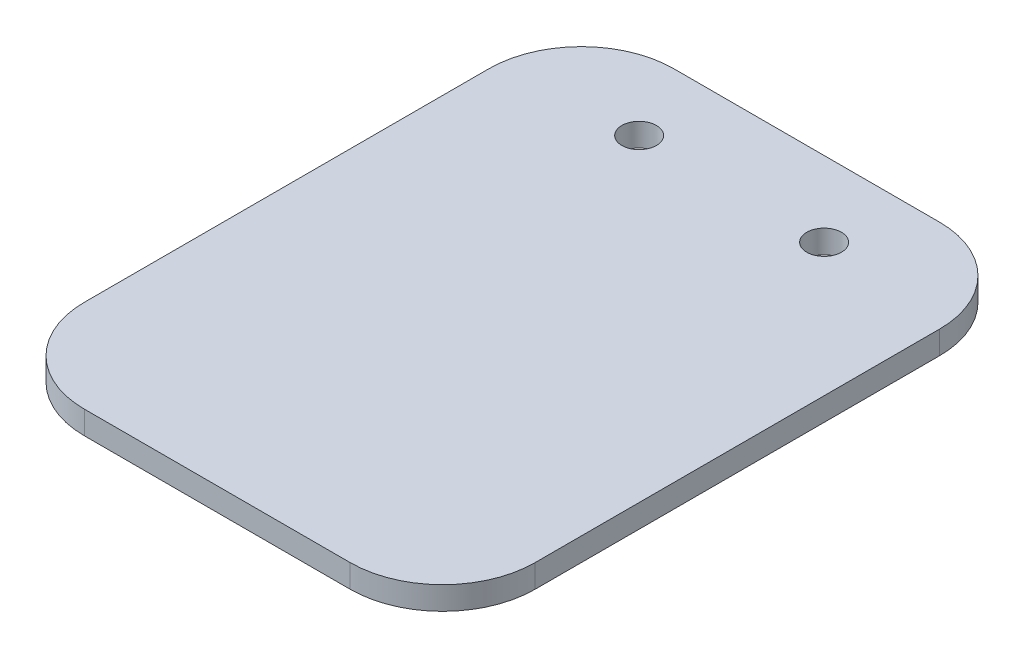
ISO-10303-21;
HEADER;
FILE_DESCRIPTION(('STEP AP214'),'2;1');
FILE_NAME('part.step','',(''),(''),'','','');
FILE_SCHEMA(('AUTOMOTIVE_DESIGN { 1 0 10303 214 1 1 1 1 }'));
ENDSEC;
DATA;
#1=APPLICATION_CONTEXT('core data for automotive mechanical design processes');
#2=APPLICATION_PROTOCOL_DEFINITION('international standard','automotive_design',2000,#1);
#3=PRODUCT_CONTEXT('',#1,'mechanical');
#4=PRODUCT('Part','Part','',(#3));
#5=PRODUCT_RELATED_PRODUCT_CATEGORY('part','',(#4));
#6=PRODUCT_DEFINITION_FORMATION('','',#4);
#7=PRODUCT_DEFINITION_CONTEXT('part definition',#1,'design');
#8=PRODUCT_DEFINITION('design','',#6,#7);
#9=PRODUCT_DEFINITION_SHAPE('','',#8);
#10=(LENGTH_UNIT() NAMED_UNIT(*) SI_UNIT(.MILLI.,.METRE.));
#11=(NAMED_UNIT(*) PLANE_ANGLE_UNIT() SI_UNIT($,.RADIAN.));
#12=(NAMED_UNIT(*) SI_UNIT($,.STERADIAN.) SOLID_ANGLE_UNIT());
#13=UNCERTAINTY_MEASURE_WITH_UNIT(LENGTH_MEASURE(1.E-05),#10,'distance_accuracy_value','');
#14=(GEOMETRIC_REPRESENTATION_CONTEXT(3) GLOBAL_UNCERTAINTY_ASSIGNED_CONTEXT((#13)) GLOBAL_UNIT_ASSIGNED_CONTEXT((#10,
#11,#12)) REPRESENTATION_CONTEXT('',''));
#15=CARTESIAN_POINT('',(0.,0.,0.));
#16=DIRECTION('',(0.,0.,1.));
#17=DIRECTION('',(1.,0.,0.));
#18=AXIS2_PLACEMENT_3D('',#15,#16,#17);
#19=CARTESIAN_POINT('',(8.,2.,-8.));
#20=DIRECTION('',(0.,-1.,0.));
#21=DIRECTION('',(0.,0.,-1.));
#22=AXIS2_PLACEMENT_3D('',#19,#20,#21);
#23=PLANE('',#22);
#24=CARTESIAN_POINT('',(8.,2.,-8.));
#25=DIRECTION('',(0.,1.,0.));
#26=DIRECTION('',(0.,0.,-1.));
#27=AXIS2_PLACEMENT_3D('',#24,#25,#26);
#28=CIRCLE('',#27,8.);
#29=CARTESIAN_POINT('',(0.,2.,-8.00000000000006));
#30=VERTEX_POINT('',#29);
#31=CARTESIAN_POINT('',(8.00000000000006,2.,0.));
#32=VERTEX_POINT('',#31);
#33=EDGE_CURVE('E170',#30,#32,#28,.T.);
#34=ORIENTED_EDGE('',*,*,#33,.T.);
#35=DIRECTION('',(1.,0.,0.));
#36=VECTOR('',#35,1.);
#37=CARTESIAN_POINT('',(8.00000000000006,2.,0.));
#38=LINE('',#37,#36);
#39=CARTESIAN_POINT('',(30.9999999999999,2.,0.));
#40=VERTEX_POINT('',#39);
#41=EDGE_CURVE('E106',#32,#40,#38,.T.);
#42=ORIENTED_EDGE('',*,*,#41,.T.);
#43=CARTESIAN_POINT('',(31.,2.,-8.));
#44=DIRECTION('',(0.,1.,0.));
#45=DIRECTION('',(0.,0.,1.));
#46=AXIS2_PLACEMENT_3D('',#43,#44,#45);
#47=CIRCLE('',#46,8.);
#48=CARTESIAN_POINT('',(39.,2.,-8.00000000000005));
#49=VERTEX_POINT('',#48);
#50=EDGE_CURVE('E191',#40,#49,#47,.T.);
#51=ORIENTED_EDGE('',*,*,#50,.T.);
#52=DIRECTION('',(0.,0.,-1.));
#53=VECTOR('',#52,1.);
#54=CARTESIAN_POINT('',(39.,2.,-8.00000000000006));
#55=LINE('',#54,#53);
#56=CARTESIAN_POINT('',(39.,2.,-42.9999999999999));
#57=VERTEX_POINT('',#56);
#58=EDGE_CURVE('E205',#49,#57,#55,.T.);
#59=ORIENTED_EDGE('',*,*,#58,.T.);
#60=CARTESIAN_POINT('',(31.,2.,-43.));
#61=DIRECTION('',(0.,1.,0.));
#62=DIRECTION('',(0.,0.,-1.));
#63=AXIS2_PLACEMENT_3D('',#60,#61,#62);
#64=CIRCLE('',#63,8.);
#65=CARTESIAN_POINT('',(30.9999999999999,2.,-51.));
#66=VERTEX_POINT('',#65);
#67=EDGE_CURVE('E125',#57,#66,#64,.T.);
#68=ORIENTED_EDGE('',*,*,#67,.T.);
#69=DIRECTION('',(-1.,0.,0.));
#70=VECTOR('',#69,1.);
#71=CARTESIAN_POINT('',(8.00000000000006,2.,-51.));
#72=LINE('',#71,#70);
#73=CARTESIAN_POINT('',(8.00000000000006,2.,-51.));
#74=VERTEX_POINT('',#73);
#75=EDGE_CURVE('E119',#66,#74,#72,.T.);
#76=ORIENTED_EDGE('',*,*,#75,.T.);
#77=CARTESIAN_POINT('',(8.,2.,-43.));
#78=DIRECTION('',(0.,1.,0.));
#79=DIRECTION('',(0.,0.,-1.));
#80=AXIS2_PLACEMENT_3D('',#77,#78,#79);
#81=CIRCLE('',#80,8.);
#82=CARTESIAN_POINT('',(0.,2.,-42.9999999999999));
#83=VERTEX_POINT('',#82);
#84=EDGE_CURVE('E123',#74,#83,#81,.T.);
#85=ORIENTED_EDGE('',*,*,#84,.T.);
#86=DIRECTION('',(0.,0.,1.));
#87=VECTOR('',#86,1.);
#88=CARTESIAN_POINT('',(0.,2.,-8.00000000000006));
#89=LINE('',#88,#87);
#90=EDGE_CURVE('E63',#83,#30,#89,.T.);
#91=ORIENTED_EDGE('',*,*,#90,.T.);
#92=EDGE_LOOP('',(#34,#42,#51,#59,#68,#76,#85,#91));
#93=FACE_BOUND('',#92,.T.);
#94=CARTESIAN_POINT('',(27.5,2.,-44.5));
#95=DIRECTION('',(0.,1.,0.));
#96=DIRECTION('',(0.,0.,1.));
#97=AXIS2_PLACEMENT_3D('',#94,#95,#96);
#98=CIRCLE('',#97,1.5);
#99=CARTESIAN_POINT('',(27.5,2.,-43.));
#100=VERTEX_POINT('',#99);
#101=EDGE_CURVE('E152',#100,#100,#98,.T.);
#102=ORIENTED_EDGE('',*,*,#101,.F.);
#103=EDGE_LOOP('',(#102));
#104=FACE_BOUND('',#103,.T.);
#105=CARTESIAN_POINT('',(11.5,2.,-44.5));
#106=DIRECTION('',(0.,1.,0.));
#107=DIRECTION('',(0.,0.,-1.));
#108=AXIS2_PLACEMENT_3D('',#105,#106,#107);
#109=CIRCLE('',#108,1.5);
#110=CARTESIAN_POINT('',(11.5,2.,-46.));
#111=VERTEX_POINT('',#110);
#112=EDGE_CURVE('E219',#111,#111,#109,.T.);
#113=ORIENTED_EDGE('',*,*,#112,.F.);
#114=EDGE_LOOP('',(#113));
#115=FACE_BOUND('',#114,.T.);
#116=ADVANCED_FACE('F45',(#93,#104,#115),#23,.F.);
#117=CARTESIAN_POINT('',(8.,0.,-8.));
#118=DIRECTION('',(0.,-1.,0.));
#119=DIRECTION('',(0.,0.,-1.));
#120=AXIS2_PLACEMENT_3D('',#117,#118,#119);
#121=PLANE('',#120);
#122=CARTESIAN_POINT('',(27.5,0.,-44.5));
#123=DIRECTION('',(0.,1.,0.));
#124=DIRECTION('',(0.,0.,1.));
#125=AXIS2_PLACEMENT_3D('',#122,#123,#124);
#126=CIRCLE('',#125,1.5);
#127=CARTESIAN_POINT('',(27.5,0.,-43.));
#128=VERTEX_POINT('',#127);
#129=EDGE_CURVE('E215',#128,#128,#126,.T.);
#130=ORIENTED_EDGE('',*,*,#129,.T.);
#131=EDGE_LOOP('',(#130));
#132=FACE_BOUND('',#131,.T.);
#133=CARTESIAN_POINT('',(8.,0.,-8.));
#134=DIRECTION('',(0.,1.,0.));
#135=DIRECTION('',(0.,0.,-1.));
#136=AXIS2_PLACEMENT_3D('',#133,#134,#135);
#137=CIRCLE('',#136,8.);
#138=CARTESIAN_POINT('',(0.,0.,-8.00000000000006));
#139=VERTEX_POINT('',#138);
#140=CARTESIAN_POINT('',(8.00000000000006,0.,0.));
#141=VERTEX_POINT('',#140);
#142=EDGE_CURVE('E147',#139,#141,#137,.T.);
#143=ORIENTED_EDGE('',*,*,#142,.F.);
#144=DIRECTION('',(0.,0.,1.));
#145=VECTOR('',#144,1.);
#146=CARTESIAN_POINT('',(0.,0.,-8.00000000000006));
#147=LINE('',#146,#145);
#148=CARTESIAN_POINT('',(0.,0.,-42.9999999999999));
#149=VERTEX_POINT('',#148);
#150=EDGE_CURVE('E98',#149,#139,#147,.T.);
#151=ORIENTED_EDGE('',*,*,#150,.F.);
#152=CARTESIAN_POINT('',(8.,0.,-43.));
#153=DIRECTION('',(0.,1.,0.));
#154=DIRECTION('',(0.,0.,-1.));
#155=AXIS2_PLACEMENT_3D('',#152,#153,#154);
#156=CIRCLE('',#155,8.);
#157=CARTESIAN_POINT('',(8.00000000000006,0.,-51.));
#158=VERTEX_POINT('',#157);
#159=EDGE_CURVE('E92',#158,#149,#156,.T.);
#160=ORIENTED_EDGE('',*,*,#159,.F.);
#161=DIRECTION('',(-1.,0.,0.));
#162=VECTOR('',#161,1.);
#163=CARTESIAN_POINT('',(8.00000000000006,0.,-51.));
#164=LINE('',#163,#162);
#165=CARTESIAN_POINT('',(30.9999999999999,0.,-51.));
#166=VERTEX_POINT('',#165);
#167=EDGE_CURVE('E134',#166,#158,#164,.T.);
#168=ORIENTED_EDGE('',*,*,#167,.F.);
#169=CARTESIAN_POINT('',(31.,0.,-43.));
#170=DIRECTION('',(0.,1.,0.));
#171=DIRECTION('',(0.,0.,-1.));
#172=AXIS2_PLACEMENT_3D('',#169,#170,#171);
#173=CIRCLE('',#172,8.);
#174=CARTESIAN_POINT('',(39.,0.,-42.9999999999999));
#175=VERTEX_POINT('',#174);
#176=EDGE_CURVE('E161',#175,#166,#173,.T.);
#177=ORIENTED_EDGE('',*,*,#176,.F.);
#178=DIRECTION('',(0.,0.,-1.));
#179=VECTOR('',#178,1.);
#180=CARTESIAN_POINT('',(39.,0.,-8.00000000000006));
#181=LINE('',#180,#179);
#182=CARTESIAN_POINT('',(39.,0.,-8.00000000000005));
#183=VERTEX_POINT('',#182);
#184=EDGE_CURVE('E158',#183,#175,#181,.T.);
#185=ORIENTED_EDGE('',*,*,#184,.F.);
#186=CARTESIAN_POINT('',(31.,0.,-8.));
#187=DIRECTION('',(0.,1.,0.));
#188=DIRECTION('',(0.,0.,1.));
#189=AXIS2_PLACEMENT_3D('',#186,#187,#188);
#190=CIRCLE('',#189,8.);
#191=CARTESIAN_POINT('',(30.9999999999999,0.,0.));
#192=VERTEX_POINT('',#191);
#193=EDGE_CURVE('E155',#192,#183,#190,.T.);
#194=ORIENTED_EDGE('',*,*,#193,.F.);
#195=DIRECTION('',(1.,0.,0.));
#196=VECTOR('',#195,1.);
#197=CARTESIAN_POINT('',(8.00000000000006,0.,0.));
#198=LINE('',#197,#196);
#199=EDGE_CURVE('E151',#141,#192,#198,.T.);
#200=ORIENTED_EDGE('',*,*,#199,.F.);
#201=EDGE_LOOP('',(#143,#151,#160,#168,#177,#185,#194,#200));
#202=FACE_BOUND('',#201,.T.);
#203=CARTESIAN_POINT('',(11.5,0.,-44.5));
#204=DIRECTION('',(0.,1.,0.));
#205=DIRECTION('',(0.,0.,-1.));
#206=AXIS2_PLACEMENT_3D('',#203,#204,#205);
#207=CIRCLE('',#206,1.5);
#208=CARTESIAN_POINT('',(11.5,0.,-46.));
#209=VERTEX_POINT('',#208);
#210=EDGE_CURVE('E223',#209,#209,#207,.T.);
#211=ORIENTED_EDGE('',*,*,#210,.T.);
#212=EDGE_LOOP('',(#211));
#213=FACE_BOUND('',#212,.T.);
#214=ADVANCED_FACE('F195',(#132,#202,#213),#121,.T.);
#215=CARTESIAN_POINT('',(8.,2.,-8.));
#216=DIRECTION('',(0.,-1.,0.));
#217=DIRECTION('',(0.,0.,-1.));
#218=AXIS2_PLACEMENT_3D('',#215,#216,#217);
#219=CYLINDRICAL_SURFACE('',#218,8.);
#220=ORIENTED_EDGE('',*,*,#142,.T.);
#221=DIRECTION('',(0.,-1.,0.));
#222=VECTOR('',#221,1.);
#223=CARTESIAN_POINT('',(8.00000000000006,2.,0.));
#224=LINE('',#223,#222);
#225=EDGE_CURVE('E11',#32,#141,#224,.T.);
#226=ORIENTED_EDGE('',*,*,#225,.F.);
#227=ORIENTED_EDGE('',*,*,#33,.F.);
#228=DIRECTION('',(0.,-1.,0.));
#229=VECTOR('',#228,1.);
#230=CARTESIAN_POINT('',(0.,2.,-8.00000000000006));
#231=LINE('',#230,#229);
#232=EDGE_CURVE('E143',#30,#139,#231,.T.);
#233=ORIENTED_EDGE('',*,*,#232,.T.);
#234=EDGE_LOOP('',(#220,#226,#227,#233));
#235=FACE_BOUND('',#234,.T.);
#236=ADVANCED_FACE('F47',(#235),#219,.T.);
#237=CARTESIAN_POINT('',(8.00000000000006,2.,0.));
#238=DIRECTION('',(0.,0.,-1.));
#239=DIRECTION('',(-1.,0.,0.));
#240=AXIS2_PLACEMENT_3D('',#237,#238,#239);
#241=PLANE('',#240);
#242=ORIENTED_EDGE('',*,*,#199,.T.);
#243=DIRECTION('',(0.,-1.,0.));
#244=VECTOR('',#243,1.);
#245=CARTESIAN_POINT('',(30.9999999999999,2.,0.));
#246=LINE('',#245,#244);
#247=EDGE_CURVE('E55',#40,#192,#246,.T.);
#248=ORIENTED_EDGE('',*,*,#247,.F.);
#249=ORIENTED_EDGE('',*,*,#41,.F.);
#250=ORIENTED_EDGE('',*,*,#225,.T.);
#251=EDGE_LOOP('',(#242,#248,#249,#250));
#252=FACE_BOUND('',#251,.T.);
#253=ADVANCED_FACE('F257',(#252),#241,.F.);
#254=CARTESIAN_POINT('',(31.,2.,-8.));
#255=DIRECTION('',(0.,-1.,0.));
#256=DIRECTION('',(0.,0.,-1.));
#257=AXIS2_PLACEMENT_3D('',#254,#255,#256);
#258=CYLINDRICAL_SURFACE('',#257,8.);
#259=ORIENTED_EDGE('',*,*,#193,.T.);
#260=DIRECTION('',(0.,-1.,0.));
#261=VECTOR('',#260,1.);
#262=CARTESIAN_POINT('',(39.,2.,-8.00000000000005));
#263=LINE('',#262,#261);
#264=EDGE_CURVE('E181',#49,#183,#263,.T.);
#265=ORIENTED_EDGE('',*,*,#264,.F.);
#266=ORIENTED_EDGE('',*,*,#50,.F.);
#267=ORIENTED_EDGE('',*,*,#247,.T.);
#268=EDGE_LOOP('',(#259,#265,#266,#267));
#269=FACE_BOUND('',#268,.T.);
#270=ADVANCED_FACE('F189',(#269),#258,.T.);
#271=CARTESIAN_POINT('',(39.,2.,-8.00000000000006));
#272=DIRECTION('',(-1.,0.,0.));
#273=DIRECTION('',(0.,0.,1.));
#274=AXIS2_PLACEMENT_3D('',#271,#272,#273);
#275=PLANE('',#274);
#276=ORIENTED_EDGE('',*,*,#184,.T.);
#277=DIRECTION('',(0.,-1.,0.));
#278=VECTOR('',#277,1.);
#279=CARTESIAN_POINT('',(39.,2.,-42.9999999999999));
#280=LINE('',#279,#278);
#281=EDGE_CURVE('E177',#57,#175,#280,.T.);
#282=ORIENTED_EDGE('',*,*,#281,.F.);
#283=ORIENTED_EDGE('',*,*,#58,.F.);
#284=ORIENTED_EDGE('',*,*,#264,.T.);
#285=EDGE_LOOP('',(#276,#282,#283,#284));
#286=FACE_BOUND('',#285,.T.);
#287=ADVANCED_FACE('F200',(#286),#275,.F.);
#288=CARTESIAN_POINT('',(31.,2.,-43.));
#289=DIRECTION('',(0.,-1.,0.));
#290=DIRECTION('',(0.,0.,-1.));
#291=AXIS2_PLACEMENT_3D('',#288,#289,#290);
#292=CYLINDRICAL_SURFACE('',#291,8.);
#293=ORIENTED_EDGE('',*,*,#176,.T.);
#294=DIRECTION('',(0.,-1.,0.));
#295=VECTOR('',#294,1.);
#296=CARTESIAN_POINT('',(30.9999999999999,2.,-51.));
#297=LINE('',#296,#295);
#298=EDGE_CURVE('E136',#66,#166,#297,.T.);
#299=ORIENTED_EDGE('',*,*,#298,.F.);
#300=ORIENTED_EDGE('',*,*,#67,.F.);
#301=ORIENTED_EDGE('',*,*,#281,.T.);
#302=EDGE_LOOP('',(#293,#299,#300,#301));
#303=FACE_BOUND('',#302,.T.);
#304=ADVANCED_FACE('F203',(#303),#292,.T.);
#305=CARTESIAN_POINT('',(8.00000000000006,2.,-51.));
#306=DIRECTION('',(0.,0.,1.));
#307=DIRECTION('',(1.,0.,0.));
#308=AXIS2_PLACEMENT_3D('',#305,#306,#307);
#309=PLANE('',#308);
#310=ORIENTED_EDGE('',*,*,#167,.T.);
#311=DIRECTION('',(0.,-1.,0.));
#312=VECTOR('',#311,1.);
#313=CARTESIAN_POINT('',(8.00000000000006,2.,-51.));
#314=LINE('',#313,#312);
#315=EDGE_CURVE('E131',#74,#158,#314,.T.);
#316=ORIENTED_EDGE('',*,*,#315,.F.);
#317=ORIENTED_EDGE('',*,*,#75,.F.);
#318=ORIENTED_EDGE('',*,*,#298,.T.);
#319=EDGE_LOOP('',(#310,#316,#317,#318));
#320=FACE_BOUND('',#319,.T.);
#321=ADVANCED_FACE('F132',(#320),#309,.F.);
#322=CARTESIAN_POINT('',(8.,2.,-43.));
#323=DIRECTION('',(0.,-1.,0.));
#324=DIRECTION('',(0.,0.,-1.));
#325=AXIS2_PLACEMENT_3D('',#322,#323,#324);
#326=CYLINDRICAL_SURFACE('',#325,8.);
#327=ORIENTED_EDGE('',*,*,#159,.T.);
#328=DIRECTION('',(0.,-1.,0.));
#329=VECTOR('',#328,1.);
#330=CARTESIAN_POINT('',(0.,2.,-42.9999999999999));
#331=LINE('',#330,#329);
#332=EDGE_CURVE('E137',#83,#149,#331,.T.);
#333=ORIENTED_EDGE('',*,*,#332,.F.);
#334=ORIENTED_EDGE('',*,*,#84,.F.);
#335=ORIENTED_EDGE('',*,*,#315,.T.);
#336=EDGE_LOOP('',(#327,#333,#334,#335));
#337=FACE_BOUND('',#336,.T.);
#338=ADVANCED_FACE('F139',(#337),#326,.T.);
#339=CARTESIAN_POINT('',(0.,2.,-8.00000000000006));
#340=DIRECTION('',(1.,0.,0.));
#341=DIRECTION('',(0.,0.,-1.));
#342=AXIS2_PLACEMENT_3D('',#339,#340,#341);
#343=PLANE('',#342);
#344=ORIENTED_EDGE('',*,*,#150,.T.);
#345=ORIENTED_EDGE('',*,*,#232,.F.);
#346=ORIENTED_EDGE('',*,*,#90,.F.);
#347=ORIENTED_EDGE('',*,*,#332,.T.);
#348=EDGE_LOOP('',(#344,#345,#346,#347));
#349=FACE_BOUND('',#348,.T.);
#350=ADVANCED_FACE('F245',(#349),#343,.F.);
#351=CARTESIAN_POINT('',(27.5,2.,-44.5));
#352=DIRECTION('',(0.,-1.,0.));
#353=DIRECTION('',(0.,0.,-1.));
#354=AXIS2_PLACEMENT_3D('',#351,#352,#353);
#355=CYLINDRICAL_SURFACE('',#354,1.5);
#356=ORIENTED_EDGE('',*,*,#101,.T.);
#357=EDGE_LOOP('',(#356));
#358=FACE_BOUND('',#357,.T.);
#359=ORIENTED_EDGE('',*,*,#129,.F.);
#360=EDGE_LOOP('',(#359));
#361=FACE_BOUND('',#360,.T.);
#362=ADVANCED_FACE('F242',(#358,#361),#355,.F.);
#363=CARTESIAN_POINT('',(11.5,2.,-44.5));
#364=DIRECTION('',(0.,-1.,0.));
#365=DIRECTION('',(0.,0.,-1.));
#366=AXIS2_PLACEMENT_3D('',#363,#364,#365);
#367=CYLINDRICAL_SURFACE('',#366,1.5);
#368=ORIENTED_EDGE('',*,*,#112,.T.);
#369=EDGE_LOOP('',(#368));
#370=FACE_BOUND('',#369,.T.);
#371=ORIENTED_EDGE('',*,*,#210,.F.);
#372=EDGE_LOOP('',(#371));
#373=FACE_BOUND('',#372,.T.);
#374=ADVANCED_FACE('F231',(#370,#373),#367,.F.);
#375=CLOSED_SHELL('',(#116,#214,#236,#253,#270,#287,#304,#321,#338,#350,#362,#374));
#376=MANIFOLD_SOLID_BREP('B2',#375);
#377=ADVANCED_BREP_SHAPE_REPRESENTATION('',(#18,#376),#14);
#378=SHAPE_DEFINITION_REPRESENTATION(#9,#377);
ENDSEC;
END-ISO-10303-21;
